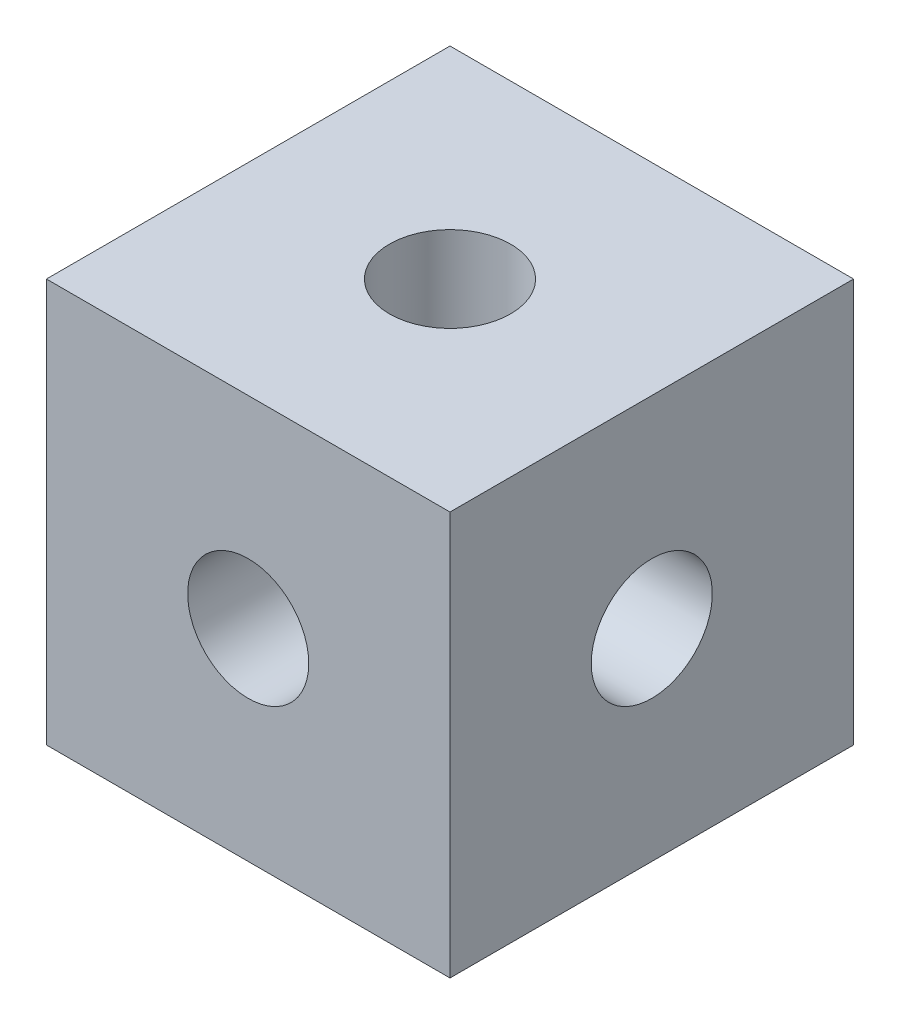
ISO-10303-21;
HEADER;
FILE_DESCRIPTION(('STEP AP214'),'2;1');
FILE_NAME('part.step','',(''),(''),'','','');
FILE_SCHEMA(('AUTOMOTIVE_DESIGN { 1 0 10303 214 1 1 1 1 }'));
ENDSEC;
DATA;
#1=APPLICATION_CONTEXT('core data for automotive mechanical design processes');
#2=APPLICATION_PROTOCOL_DEFINITION('international standard','automotive_design',2000,#1);
#3=PRODUCT_CONTEXT('',#1,'mechanical');
#4=PRODUCT('Part','Part','',(#3));
#5=PRODUCT_RELATED_PRODUCT_CATEGORY('part','',(#4));
#6=PRODUCT_DEFINITION_FORMATION('','',#4);
#7=PRODUCT_DEFINITION_CONTEXT('part definition',#1,'design');
#8=PRODUCT_DEFINITION('design','',#6,#7);
#9=PRODUCT_DEFINITION_SHAPE('','',#8);
#10=(LENGTH_UNIT() NAMED_UNIT(*) SI_UNIT(.MILLI.,.METRE.));
#11=(NAMED_UNIT(*) PLANE_ANGLE_UNIT() SI_UNIT($,.RADIAN.));
#12=(NAMED_UNIT(*) SI_UNIT($,.STERADIAN.) SOLID_ANGLE_UNIT());
#13=UNCERTAINTY_MEASURE_WITH_UNIT(LENGTH_MEASURE(1.E-05),#10,'distance_accuracy_value','');
#14=(GEOMETRIC_REPRESENTATION_CONTEXT(3) GLOBAL_UNCERTAINTY_ASSIGNED_CONTEXT((#13)) GLOBAL_UNIT_ASSIGNED_CONTEXT((#10,
#11,#12)) REPRESENTATION_CONTEXT('',''));
#15=CARTESIAN_POINT('',(0.,0.,0.));
#16=DIRECTION('',(0.,0.,1.));
#17=DIRECTION('',(1.,0.,0.));
#18=AXIS2_PLACEMENT_3D('',#15,#16,#17);
#19=CARTESIAN_POINT('',(5.,5.,0.));
#20=DIRECTION('',(0.,0.,1.));
#21=DIRECTION('',(1.,0.,0.));
#22=AXIS2_PLACEMENT_3D('',#19,#20,#21);
#23=CYLINDRICAL_SURFACE('',#22,1.5);
#24=CARTESIAN_POINT('',(5.,5.,10.));
#25=DIRECTION('',(0.,0.,1.));
#26=DIRECTION('',(1.,0.,0.));
#27=AXIS2_PLACEMENT_3D('',#24,#25,#26);
#28=CIRCLE('',#27,1.5);
#29=CARTESIAN_POINT('',(6.5,5.,10.));
#30=VERTEX_POINT('',#29);
#31=EDGE_CURVE('E143',#30,#30,#28,.T.);
#32=ORIENTED_EDGE('',*,*,#31,.T.);
#33=EDGE_LOOP('',(#32));
#34=FACE_BOUND('',#33,.T.);
#35=CARTESIAN_POINT('',(5.,5.,5.));
#36=DIRECTION('',(-0.707106781186547,0.,0.707106781186547));
#37=DIRECTION('',(0.707106781186547,0.,0.707106781186547));
#38=AXIS2_PLACEMENT_3D('',#35,#36,#37);
#39=ELLIPSE('',#38,2.12132034355964,1.5);
#40=CARTESIAN_POINT('',(6.06066017177982,6.06066017177982,6.06066017177982));
#41=VERTEX_POINT('',#40);
#42=CARTESIAN_POINT('',(6.06066017177982,3.93933982822018,6.06066017177982));
#43=VERTEX_POINT('',#42);
#44=EDGE_CURVE('E107',#41,#43,#39,.F.);
#45=ORIENTED_EDGE('',*,*,#44,.T.);
#46=CARTESIAN_POINT('',(5.,5.,5.));
#47=DIRECTION('',(0.,0.707106781186547,0.707106781186547));
#48=DIRECTION('',(0.,-0.707106781186547,0.707106781186547));
#49=AXIS2_PLACEMENT_3D('',#46,#47,#48);
#50=ELLIPSE('',#49,2.12132034355964,1.5);
#51=CARTESIAN_POINT('',(3.93933982822018,3.93933982822018,6.06066017177982));
#52=VERTEX_POINT('',#51);
#53=EDGE_CURVE('E53',#43,#52,#50,.F.);
#54=ORIENTED_EDGE('',*,*,#53,.T.);
#55=CARTESIAN_POINT('',(5.,5.,5.));
#56=DIRECTION('',(0.707106781186547,0.,0.707106781186547));
#57=DIRECTION('',(-0.707106781186547,0.,0.707106781186547));
#58=AXIS2_PLACEMENT_3D('',#55,#56,#57);
#59=ELLIPSE('',#58,2.12132034355964,1.5);
#60=CARTESIAN_POINT('',(3.93933982822018,6.06066017177982,6.06066017177982));
#61=VERTEX_POINT('',#60);
#62=EDGE_CURVE('E119',#52,#61,#59,.F.);
#63=ORIENTED_EDGE('',*,*,#62,.T.);
#64=CARTESIAN_POINT('',(5.,5.,5.));
#65=DIRECTION('',(0.,-0.707106781186547,0.707106781186547));
#66=DIRECTION('',(0.,0.707106781186547,0.707106781186547));
#67=AXIS2_PLACEMENT_3D('',#64,#65,#66);
#68=ELLIPSE('',#67,2.12132034355964,1.5);
#69=EDGE_CURVE('E130',#61,#41,#68,.F.);
#70=ORIENTED_EDGE('',*,*,#69,.T.);
#71=EDGE_LOOP('',(#45,#54,#63,#70));
#72=FACE_BOUND('',#71,.T.);
#73=ADVANCED_FACE('F38',(#34,#72),#23,.F.);
#74=CARTESIAN_POINT('',(0.,0.,10.));
#75=DIRECTION('',(1.,0.,0.));
#76=DIRECTION('',(0.,0.,-1.));
#77=AXIS2_PLACEMENT_3D('',#74,#75,#76);
#78=PLANE('',#77);
#79=CARTESIAN_POINT('',(0.,5.,5.));
#80=DIRECTION('',(-1.,0.,0.));
#81=DIRECTION('',(0.,0.,1.));
#82=AXIS2_PLACEMENT_3D('',#79,#80,#81);
#83=CIRCLE('',#82,1.5);
#84=CARTESIAN_POINT('',(0.,5.,6.5));
#85=VERTEX_POINT('',#84);
#86=EDGE_CURVE('E134',#85,#85,#83,.T.);
#87=ORIENTED_EDGE('',*,*,#86,.F.);
#88=EDGE_LOOP('',(#87));
#89=FACE_BOUND('',#88,.T.);
#90=DIRECTION('',(0.,-1.,0.));
#91=VECTOR('',#90,1.);
#92=CARTESIAN_POINT('',(0.,0.,0.));
#93=LINE('',#92,#91);
#94=CARTESIAN_POINT('',(0.,10.,0.));
#95=VERTEX_POINT('',#94);
#96=CARTESIAN_POINT('',(0.,0.,0.));
#97=VERTEX_POINT('',#96);
#98=EDGE_CURVE('E149',#95,#97,#93,.T.);
#99=ORIENTED_EDGE('',*,*,#98,.T.);
#100=DIRECTION('',(0.,0.,-1.));
#101=VECTOR('',#100,1.);
#102=CARTESIAN_POINT('',(0.,0.,10.));
#103=LINE('',#102,#101);
#104=CARTESIAN_POINT('',(0.,0.,10.));
#105=VERTEX_POINT('',#104);
#106=EDGE_CURVE('E123',#105,#97,#103,.T.);
#107=ORIENTED_EDGE('',*,*,#106,.F.);
#108=DIRECTION('',(0.,-1.,0.));
#109=VECTOR('',#108,1.);
#110=CARTESIAN_POINT('',(0.,0.,10.));
#111=LINE('',#110,#109);
#112=CARTESIAN_POINT('',(0.,10.,10.));
#113=VERTEX_POINT('',#112);
#114=EDGE_CURVE('E152',#113,#105,#111,.T.);
#115=ORIENTED_EDGE('',*,*,#114,.F.);
#116=DIRECTION('',(0.,0.,-1.));
#117=VECTOR('',#116,1.);
#118=CARTESIAN_POINT('',(0.,10.,10.));
#119=LINE('',#118,#117);
#120=EDGE_CURVE('E162',#113,#95,#119,.T.);
#121=ORIENTED_EDGE('',*,*,#120,.T.);
#122=EDGE_LOOP('',(#99,#107,#115,#121));
#123=FACE_BOUND('',#122,.T.);
#124=ADVANCED_FACE('F40',(#89,#123),#78,.F.);
#125=CARTESIAN_POINT('',(0.,0.,10.));
#126=DIRECTION('',(0.,1.,0.));
#127=DIRECTION('',(0.,0.,1.));
#128=AXIS2_PLACEMENT_3D('',#125,#126,#127);
#129=PLANE('',#128);
#130=CARTESIAN_POINT('',(5.,0.,5.));
#131=DIRECTION('',(0.,1.,0.));
#132=DIRECTION('',(0.,0.,1.));
#133=AXIS2_PLACEMENT_3D('',#130,#131,#132);
#134=CIRCLE('',#133,1.5);
#135=CARTESIAN_POINT('',(5.,0.,6.5));
#136=VERTEX_POINT('',#135);
#137=EDGE_CURVE('E116',#136,#136,#134,.T.);
#138=ORIENTED_EDGE('',*,*,#137,.T.);
#139=EDGE_LOOP('',(#138));
#140=FACE_BOUND('',#139,.T.);
#141=DIRECTION('',(1.,0.,0.));
#142=VECTOR('',#141,1.);
#143=CARTESIAN_POINT('',(0.,0.,0.));
#144=LINE('',#143,#142);
#145=CARTESIAN_POINT('',(10.,0.,0.));
#146=VERTEX_POINT('',#145);
#147=EDGE_CURVE('E165',#97,#146,#144,.T.);
#148=ORIENTED_EDGE('',*,*,#147,.T.);
#149=DIRECTION('',(0.,0.,-1.));
#150=VECTOR('',#149,1.);
#151=CARTESIAN_POINT('',(10.,0.,10.));
#152=LINE('',#151,#150);
#153=CARTESIAN_POINT('',(10.,0.,10.));
#154=VERTEX_POINT('',#153);
#155=EDGE_CURVE('E175',#154,#146,#152,.T.);
#156=ORIENTED_EDGE('',*,*,#155,.F.);
#157=DIRECTION('',(1.,0.,0.));
#158=VECTOR('',#157,1.);
#159=CARTESIAN_POINT('',(0.,0.,10.));
#160=LINE('',#159,#158);
#161=EDGE_CURVE('E155',#105,#154,#160,.T.);
#162=ORIENTED_EDGE('',*,*,#161,.F.);
#163=ORIENTED_EDGE('',*,*,#106,.T.);
#164=EDGE_LOOP('',(#148,#156,#162,#163));
#165=FACE_BOUND('',#164,.T.);
#166=ADVANCED_FACE('F180',(#140,#165),#129,.F.);
#167=CARTESIAN_POINT('',(10.,0.,10.));
#168=DIRECTION('',(-1.,0.,0.));
#169=DIRECTION('',(0.,0.,1.));
#170=AXIS2_PLACEMENT_3D('',#167,#168,#169);
#171=PLANE('',#170);
#172=CARTESIAN_POINT('',(10.,5.,5.));
#173=DIRECTION('',(-1.,0.,0.));
#174=DIRECTION('',(0.,0.,1.));
#175=AXIS2_PLACEMENT_3D('',#172,#173,#174);
#176=CIRCLE('',#175,1.5);
#177=CARTESIAN_POINT('',(10.,5.,6.5));
#178=VERTEX_POINT('',#177);
#179=EDGE_CURVE('E140',#178,#178,#176,.T.);
#180=ORIENTED_EDGE('',*,*,#179,.T.);
#181=EDGE_LOOP('',(#180));
#182=FACE_BOUND('',#181,.T.);
#183=DIRECTION('',(0.,1.,0.));
#184=VECTOR('',#183,1.);
#185=CARTESIAN_POINT('',(10.,0.,0.));
#186=LINE('',#185,#184);
#187=CARTESIAN_POINT('',(10.,10.,0.));
#188=VERTEX_POINT('',#187);
#189=EDGE_CURVE('E167',#146,#188,#186,.T.);
#190=ORIENTED_EDGE('',*,*,#189,.T.);
#191=DIRECTION('',(0.,0.,-1.));
#192=VECTOR('',#191,1.);
#193=CARTESIAN_POINT('',(10.,10.,10.));
#194=LINE('',#193,#192);
#195=CARTESIAN_POINT('',(10.,10.,10.));
#196=VERTEX_POINT('',#195);
#197=EDGE_CURVE('E172',#196,#188,#194,.T.);
#198=ORIENTED_EDGE('',*,*,#197,.F.);
#199=DIRECTION('',(0.,1.,0.));
#200=VECTOR('',#199,1.);
#201=CARTESIAN_POINT('',(10.,0.,10.));
#202=LINE('',#201,#200);
#203=EDGE_CURVE('E158',#154,#196,#202,.T.);
#204=ORIENTED_EDGE('',*,*,#203,.F.);
#205=ORIENTED_EDGE('',*,*,#155,.T.);
#206=EDGE_LOOP('',(#190,#198,#204,#205));
#207=FACE_BOUND('',#206,.T.);
#208=ADVANCED_FACE('F192',(#182,#207),#171,.F.);
#209=CARTESIAN_POINT('',(0.,10.,10.));
#210=DIRECTION('',(0.,-1.,0.));
#211=DIRECTION('',(0.,0.,-1.));
#212=AXIS2_PLACEMENT_3D('',#209,#210,#211);
#213=PLANE('',#212);
#214=CARTESIAN_POINT('',(5.,10.,5.));
#215=DIRECTION('',(0.,1.,0.));
#216=DIRECTION('',(0.,0.,1.));
#217=AXIS2_PLACEMENT_3D('',#214,#215,#216);
#218=CIRCLE('',#217,1.5);
#219=CARTESIAN_POINT('',(5.,10.,6.5));
#220=VERTEX_POINT('',#219);
#221=EDGE_CURVE('E240',#220,#220,#218,.T.);
#222=ORIENTED_EDGE('',*,*,#221,.F.);
#223=EDGE_LOOP('',(#222));
#224=FACE_BOUND('',#223,.T.);
#225=DIRECTION('',(-1.,0.,0.));
#226=VECTOR('',#225,1.);
#227=CARTESIAN_POINT('',(0.,10.,0.));
#228=LINE('',#227,#226);
#229=EDGE_CURVE('E156',#188,#95,#228,.T.);
#230=ORIENTED_EDGE('',*,*,#229,.T.);
#231=ORIENTED_EDGE('',*,*,#120,.F.);
#232=DIRECTION('',(-1.,0.,0.));
#233=VECTOR('',#232,1.);
#234=CARTESIAN_POINT('',(0.,10.,10.));
#235=LINE('',#234,#233);
#236=EDGE_CURVE('E160',#196,#113,#235,.T.);
#237=ORIENTED_EDGE('',*,*,#236,.F.);
#238=ORIENTED_EDGE('',*,*,#197,.T.);
#239=EDGE_LOOP('',(#230,#231,#237,#238));
#240=FACE_BOUND('',#239,.T.);
#241=ADVANCED_FACE('F196',(#224,#240),#213,.F.);
#242=CARTESIAN_POINT('',(0.,0.,10.));
#243=DIRECTION('',(0.,0.,-1.));
#244=DIRECTION('',(-1.,0.,0.));
#245=AXIS2_PLACEMENT_3D('',#242,#243,#244);
#246=PLANE('',#245);
#247=ORIENTED_EDGE('',*,*,#31,.F.);
#248=EDGE_LOOP('',(#247));
#249=FACE_BOUND('',#248,.T.);
#250=ORIENTED_EDGE('',*,*,#114,.T.);
#251=ORIENTED_EDGE('',*,*,#161,.T.);
#252=ORIENTED_EDGE('',*,*,#203,.T.);
#253=ORIENTED_EDGE('',*,*,#236,.T.);
#254=EDGE_LOOP('',(#250,#251,#252,#253));
#255=FACE_BOUND('',#254,.T.);
#256=ADVANCED_FACE('F198',(#249,#255),#246,.F.);
#257=CARTESIAN_POINT('',(0.,0.,0.));
#258=DIRECTION('',(0.,0.,-1.));
#259=DIRECTION('',(-1.,0.,0.));
#260=AXIS2_PLACEMENT_3D('',#257,#258,#259);
#261=PLANE('',#260);
#262=CARTESIAN_POINT('',(5.,5.,0.));
#263=DIRECTION('',(0.,0.,1.));
#264=DIRECTION('',(1.,0.,0.));
#265=AXIS2_PLACEMENT_3D('',#262,#263,#264);
#266=CIRCLE('',#265,1.5);
#267=CARTESIAN_POINT('',(6.5,5.,0.));
#268=VERTEX_POINT('',#267);
#269=EDGE_CURVE('E146',#268,#268,#266,.T.);
#270=ORIENTED_EDGE('',*,*,#269,.T.);
#271=EDGE_LOOP('',(#270));
#272=FACE_BOUND('',#271,.T.);
#273=ORIENTED_EDGE('',*,*,#98,.F.);
#274=ORIENTED_EDGE('',*,*,#229,.F.);
#275=ORIENTED_EDGE('',*,*,#189,.F.);
#276=ORIENTED_EDGE('',*,*,#147,.F.);
#277=EDGE_LOOP('',(#273,#274,#275,#276));
#278=FACE_BOUND('',#277,.T.);
#279=ADVANCED_FACE('F188',(#272,#278),#261,.T.);
#280=CARTESIAN_POINT('',(5.,5.,5.));
#281=DIRECTION('',(0.707106781186547,0.,0.707106781186547));
#282=DIRECTION('',(-0.707106781186547,0.,0.707106781186547));
#283=AXIS2_PLACEMENT_3D('',#280,#281,#282);
#284=ELLIPSE('',#283,2.12132034355964,1.5);
#285=CARTESIAN_POINT('',(6.06066017177982,3.93933982822018,3.93933982822018));
#286=VERTEX_POINT('',#285);
#287=CARTESIAN_POINT('',(6.06066017177982,6.06066017177982,3.93933982822018));
#288=VERTEX_POINT('',#287);
#289=EDGE_CURVE('E113',#286,#288,#284,.T.);
#290=ORIENTED_EDGE('',*,*,#289,.T.);
#291=CARTESIAN_POINT('',(5.,5.,5.));
#292=DIRECTION('',(0.,0.707106781186547,0.707106781186547));
#293=DIRECTION('',(0.,-0.707106781186547,0.707106781186547));
#294=AXIS2_PLACEMENT_3D('',#291,#292,#293);
#295=ELLIPSE('',#294,2.12132034355964,1.5);
#296=CARTESIAN_POINT('',(3.93933982822018,6.06066017177982,3.93933982822018));
#297=VERTEX_POINT('',#296);
#298=EDGE_CURVE('E61',#288,#297,#295,.T.);
#299=ORIENTED_EDGE('',*,*,#298,.T.);
#300=CARTESIAN_POINT('',(5.,5.,5.));
#301=DIRECTION('',(-0.707106781186547,0.,0.707106781186547));
#302=DIRECTION('',(0.707106781186547,0.,0.707106781186547));
#303=AXIS2_PLACEMENT_3D('',#300,#301,#302);
#304=ELLIPSE('',#303,2.12132034355964,1.5);
#305=CARTESIAN_POINT('',(3.93933982822018,3.93933982822018,3.93933982822018));
#306=VERTEX_POINT('',#305);
#307=EDGE_CURVE('E115',#297,#306,#304,.T.);
#308=ORIENTED_EDGE('',*,*,#307,.T.);
#309=CARTESIAN_POINT('',(5.,5.,5.));
#310=DIRECTION('',(0.,-0.707106781186547,0.707106781186547));
#311=DIRECTION('',(0.,0.707106781186547,0.707106781186547));
#312=AXIS2_PLACEMENT_3D('',#309,#310,#311);
#313=ELLIPSE('',#312,2.12132034355964,1.5);
#314=EDGE_CURVE('E101',#306,#286,#313,.T.);
#315=ORIENTED_EDGE('',*,*,#314,.T.);
#316=EDGE_LOOP('',(#290,#299,#308,#315));
#317=FACE_BOUND('',#316,.T.);
#318=ORIENTED_EDGE('',*,*,#269,.F.);
#319=EDGE_LOOP('',(#318));
#320=FACE_BOUND('',#319,.T.);
#321=ADVANCED_FACE('F111',(#317,#320),#23,.F.);
#322=CARTESIAN_POINT('',(10.,5.,5.));
#323=DIRECTION('',(-1.,0.,0.));
#324=DIRECTION('',(0.,0.,1.));
#325=AXIS2_PLACEMENT_3D('',#322,#323,#324);
#326=CYLINDRICAL_SURFACE('',#325,1.5);
#327=ORIENTED_EDGE('',*,*,#86,.T.);
#328=EDGE_LOOP('',(#327));
#329=FACE_BOUND('',#328,.T.);
#330=ORIENTED_EDGE('',*,*,#62,.F.);
#331=CARTESIAN_POINT('',(5.,5.,5.));
#332=DIRECTION('',(-0.707106781186547,0.707106781186547,0.));
#333=DIRECTION('',(-0.707106781186547,-0.707106781186547,0.));
#334=AXIS2_PLACEMENT_3D('',#331,#332,#333);
#335=ELLIPSE('',#334,2.12132034355964,1.5);
#336=EDGE_CURVE('E136',#52,#306,#335,.F.);
#337=ORIENTED_EDGE('',*,*,#336,.T.);
#338=ORIENTED_EDGE('',*,*,#307,.F.);
#339=CARTESIAN_POINT('',(5.,5.,5.));
#340=DIRECTION('',(-0.707106781186547,-0.707106781186547,0.));
#341=DIRECTION('',(-0.707106781186547,0.707106781186547,0.));
#342=AXIS2_PLACEMENT_3D('',#339,#340,#341);
#343=ELLIPSE('',#342,2.12132034355964,1.5);
#344=EDGE_CURVE('E132',#297,#61,#343,.F.);
#345=ORIENTED_EDGE('',*,*,#344,.T.);
#346=EDGE_LOOP('',(#330,#337,#338,#345));
#347=FACE_BOUND('',#346,.T.);
#348=ADVANCED_FACE('F220',(#329,#347),#326,.F.);
#349=ORIENTED_EDGE('',*,*,#179,.F.);
#350=EDGE_LOOP('',(#349));
#351=FACE_BOUND('',#350,.T.);
#352=ORIENTED_EDGE('',*,*,#44,.F.);
#353=CARTESIAN_POINT('',(5.,5.,5.));
#354=DIRECTION('',(-0.707106781186547,0.707106781186547,0.));
#355=DIRECTION('',(-0.707106781186547,-0.707106781186547,0.));
#356=AXIS2_PLACEMENT_3D('',#353,#354,#355);
#357=ELLIPSE('',#356,2.12132034355964,1.5);
#358=EDGE_CURVE('E11',#41,#288,#357,.T.);
#359=ORIENTED_EDGE('',*,*,#358,.T.);
#360=ORIENTED_EDGE('',*,*,#289,.F.);
#361=CARTESIAN_POINT('',(5.,5.,5.));
#362=DIRECTION('',(-0.707106781186547,-0.707106781186547,0.));
#363=DIRECTION('',(-0.707106781186547,0.707106781186547,0.));
#364=AXIS2_PLACEMENT_3D('',#361,#362,#363);
#365=ELLIPSE('',#364,2.12132034355964,1.5);
#366=EDGE_CURVE('E46',#286,#43,#365,.T.);
#367=ORIENTED_EDGE('',*,*,#366,.T.);
#368=EDGE_LOOP('',(#352,#359,#360,#367));
#369=FACE_BOUND('',#368,.T.);
#370=ADVANCED_FACE('F118',(#351,#369),#326,.F.);
#371=CARTESIAN_POINT('',(5.,0.,5.));
#372=DIRECTION('',(0.,1.,0.));
#373=DIRECTION('',(0.,0.,1.));
#374=AXIS2_PLACEMENT_3D('',#371,#372,#373);
#375=CYLINDRICAL_SURFACE('',#374,1.5);
#376=ORIENTED_EDGE('',*,*,#137,.F.);
#377=EDGE_LOOP('',(#376));
#378=FACE_BOUND('',#377,.T.);
#379=ORIENTED_EDGE('',*,*,#53,.F.);
#380=ORIENTED_EDGE('',*,*,#366,.F.);
#381=ORIENTED_EDGE('',*,*,#314,.F.);
#382=ORIENTED_EDGE('',*,*,#336,.F.);
#383=EDGE_LOOP('',(#379,#380,#381,#382));
#384=FACE_BOUND('',#383,.T.);
#385=ADVANCED_FACE('F100',(#378,#384),#375,.F.);
#386=ORIENTED_EDGE('',*,*,#221,.T.);
#387=EDGE_LOOP('',(#386));
#388=FACE_BOUND('',#387,.T.);
#389=ORIENTED_EDGE('',*,*,#298,.F.);
#390=ORIENTED_EDGE('',*,*,#358,.F.);
#391=ORIENTED_EDGE('',*,*,#69,.F.);
#392=ORIENTED_EDGE('',*,*,#344,.F.);
#393=EDGE_LOOP('',(#389,#390,#391,#392));
#394=FACE_BOUND('',#393,.T.);
#395=ADVANCED_FACE('F231',(#388,#394),#375,.F.);
#396=CLOSED_SHELL('',(#73,#124,#166,#208,#241,#256,#279,#321,#348,#370,#385,#395));
#397=MANIFOLD_SOLID_BREP('B2',#396);
#398=ADVANCED_BREP_SHAPE_REPRESENTATION('',(#18,#397),#14);
#399=SHAPE_DEFINITION_REPRESENTATION(#9,#398);
ENDSEC;
END-ISO-10303-21;
